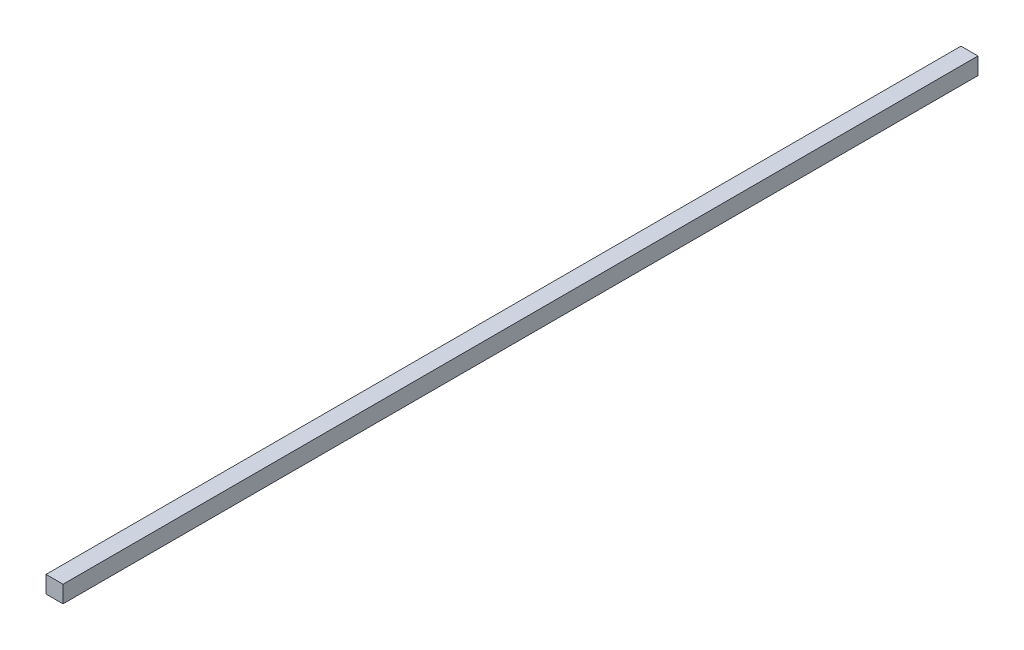
ISO-10303-21;
HEADER;
FILE_DESCRIPTION(('STEP AP214'),'2;1');
FILE_NAME('part.step','',(''),(''),'','','');
FILE_SCHEMA(('AUTOMOTIVE_DESIGN { 1 0 10303 214 1 1 1 1 }'));
ENDSEC;
DATA;
#1=APPLICATION_CONTEXT('core data for automotive mechanical design processes');
#2=APPLICATION_PROTOCOL_DEFINITION('international standard','automotive_design',2000,#1);
#3=PRODUCT_CONTEXT('',#1,'mechanical');
#4=PRODUCT('Part','Part','',(#3));
#5=PRODUCT_RELATED_PRODUCT_CATEGORY('part','',(#4));
#6=PRODUCT_DEFINITION_FORMATION('','',#4);
#7=PRODUCT_DEFINITION_CONTEXT('part definition',#1,'design');
#8=PRODUCT_DEFINITION('design','',#6,#7);
#9=PRODUCT_DEFINITION_SHAPE('','',#8);
#10=(LENGTH_UNIT() NAMED_UNIT(*) SI_UNIT(.MILLI.,.METRE.));
#11=(NAMED_UNIT(*) PLANE_ANGLE_UNIT() SI_UNIT($,.RADIAN.));
#12=(NAMED_UNIT(*) SI_UNIT($,.STERADIAN.) SOLID_ANGLE_UNIT());
#13=UNCERTAINTY_MEASURE_WITH_UNIT(LENGTH_MEASURE(1.E-05),#10,'distance_accuracy_value','');
#14=(GEOMETRIC_REPRESENTATION_CONTEXT(3) GLOBAL_UNCERTAINTY_ASSIGNED_CONTEXT((#13)) GLOBAL_UNIT_ASSIGNED_CONTEXT((#10,
#11,#12)) REPRESENTATION_CONTEXT('',''));
#15=CARTESIAN_POINT('',(0.,0.,0.));
#16=DIRECTION('',(0.,0.,1.));
#17=DIRECTION('',(1.,0.,0.));
#18=AXIS2_PLACEMENT_3D('',#15,#16,#17);
#19=CARTESIAN_POINT('',(-0.883883476483185,-0.883883476483184,95.));
#20=DIRECTION('',(1.,0.,0.));
#21=DIRECTION('',(0.,0.,-1.));
#22=AXIS2_PLACEMENT_3D('',#19,#20,#21);
#23=PLANE('',#22);
#24=DIRECTION('',(0.,-1.,0.));
#25=VECTOR('',#24,1.);
#26=CARTESIAN_POINT('',(-0.883883476483185,-0.883883476483184,0.));
#27=LINE('',#26,#25);
#28=CARTESIAN_POINT('',(-0.883883476483185,0.883883476483185,0.));
#29=VERTEX_POINT('',#28);
#30=CARTESIAN_POINT('',(-0.883883476483185,-0.883883476483184,0.));
#31=VERTEX_POINT('',#30);
#32=EDGE_CURVE('E95',#29,#31,#27,.T.);
#33=ORIENTED_EDGE('',*,*,#32,.T.);
#34=DIRECTION('',(0.,0.,-1.));
#35=VECTOR('',#34,1.);
#36=CARTESIAN_POINT('',(-0.883883476483185,-0.883883476483184,95.));
#37=LINE('',#36,#35);
#38=CARTESIAN_POINT('',(-0.883883476483185,-0.883883476483184,95.));
#39=VERTEX_POINT('',#38);
#40=EDGE_CURVE('E11',#39,#31,#37,.T.);
#41=ORIENTED_EDGE('',*,*,#40,.F.);
#42=DIRECTION('',(0.,-1.,0.));
#43=VECTOR('',#42,1.);
#44=CARTESIAN_POINT('',(-0.883883476483185,-0.883883476483184,95.));
#45=LINE('',#44,#43);
#46=CARTESIAN_POINT('',(-0.883883476483185,0.883883476483185,95.));
#47=VERTEX_POINT('',#46);
#48=EDGE_CURVE('E83',#47,#39,#45,.T.);
#49=ORIENTED_EDGE('',*,*,#48,.F.);
#50=DIRECTION('',(0.,0.,-1.));
#51=VECTOR('',#50,1.);
#52=CARTESIAN_POINT('',(-0.883883476483185,0.883883476483185,95.));
#53=LINE('',#52,#51);
#54=EDGE_CURVE('E91',#47,#29,#53,.T.);
#55=ORIENTED_EDGE('',*,*,#54,.T.);
#56=EDGE_LOOP('',(#33,#41,#49,#55));
#57=FACE_BOUND('',#56,.T.);
#58=ADVANCED_FACE('F32',(#57),#23,.F.);
#59=CARTESIAN_POINT('',(0.883883476483184,-0.883883476483184,95.));
#60=DIRECTION('',(0.,1.,0.));
#61=DIRECTION('',(-1.,0.,0.));
#62=AXIS2_PLACEMENT_3D('',#59,#60,#61);
#63=PLANE('',#62);
#64=DIRECTION('',(1.,0.,0.));
#65=VECTOR('',#64,1.);
#66=CARTESIAN_POINT('',(0.883883476483184,-0.883883476483184,0.));
#67=LINE('',#66,#65);
#68=CARTESIAN_POINT('',(0.883883476483184,-0.883883476483184,0.));
#69=VERTEX_POINT('',#68);
#70=EDGE_CURVE('E87',#31,#69,#67,.T.);
#71=ORIENTED_EDGE('',*,*,#70,.T.);
#72=DIRECTION('',(0.,0.,-1.));
#73=VECTOR('',#72,1.);
#74=CARTESIAN_POINT('',(0.883883476483184,-0.883883476483184,95.));
#75=LINE('',#74,#73);
#76=CARTESIAN_POINT('',(0.883883476483184,-0.883883476483184,95.));
#77=VERTEX_POINT('',#76);
#78=EDGE_CURVE('E40',#77,#69,#75,.T.);
#79=ORIENTED_EDGE('',*,*,#78,.F.);
#80=DIRECTION('',(1.,0.,0.));
#81=VECTOR('',#80,1.);
#82=CARTESIAN_POINT('',(0.883883476483184,-0.883883476483184,95.));
#83=LINE('',#82,#81);
#84=EDGE_CURVE('E78',#39,#77,#83,.T.);
#85=ORIENTED_EDGE('',*,*,#84,.F.);
#86=ORIENTED_EDGE('',*,*,#40,.T.);
#87=EDGE_LOOP('',(#71,#79,#85,#86));
#88=FACE_BOUND('',#87,.T.);
#89=ADVANCED_FACE('F86',(#88),#63,.F.);
#90=CARTESIAN_POINT('',(0.883883476483184,-0.883883476483184,95.));
#91=DIRECTION('',(-1.,0.,0.));
#92=DIRECTION('',(0.,-1.,0.));
#93=AXIS2_PLACEMENT_3D('',#90,#91,#92);
#94=PLANE('',#93);
#95=DIRECTION('',(0.,1.,0.));
#96=VECTOR('',#95,1.);
#97=CARTESIAN_POINT('',(0.883883476483184,-0.883883476483184,0.));
#98=LINE('',#97,#96);
#99=CARTESIAN_POINT('',(0.883883476483184,0.883883476483185,0.));
#100=VERTEX_POINT('',#99);
#101=EDGE_CURVE('E65',#69,#100,#98,.T.);
#102=ORIENTED_EDGE('',*,*,#101,.T.);
#103=DIRECTION('',(0.,0.,-1.));
#104=VECTOR('',#103,1.);
#105=CARTESIAN_POINT('',(0.883883476483184,0.883883476483185,95.));
#106=LINE('',#105,#104);
#107=CARTESIAN_POINT('',(0.883883476483184,0.883883476483185,95.));
#108=VERTEX_POINT('',#107);
#109=EDGE_CURVE('E88',#108,#100,#106,.T.);
#110=ORIENTED_EDGE('',*,*,#109,.F.);
#111=DIRECTION('',(0.,1.,0.));
#112=VECTOR('',#111,1.);
#113=CARTESIAN_POINT('',(0.883883476483184,-0.883883476483184,95.));
#114=LINE('',#113,#112);
#115=EDGE_CURVE('E81',#77,#108,#114,.T.);
#116=ORIENTED_EDGE('',*,*,#115,.F.);
#117=ORIENTED_EDGE('',*,*,#78,.T.);
#118=EDGE_LOOP('',(#102,#110,#116,#117));
#119=FACE_BOUND('',#118,.T.);
#120=ADVANCED_FACE('F89',(#119),#94,.F.);
#121=CARTESIAN_POINT('',(0.883883476483184,0.883883476483185,95.));
#122=DIRECTION('',(0.,-1.,0.));
#123=DIRECTION('',(1.,0.,0.));
#124=AXIS2_PLACEMENT_3D('',#121,#122,#123);
#125=PLANE('',#124);
#126=DIRECTION('',(-1.,0.,0.));
#127=VECTOR('',#126,1.);
#128=CARTESIAN_POINT('',(0.883883476483184,0.883883476483185,0.));
#129=LINE('',#128,#127);
#130=EDGE_CURVE('E71',#100,#29,#129,.T.);
#131=ORIENTED_EDGE('',*,*,#130,.T.);
#132=ORIENTED_EDGE('',*,*,#54,.F.);
#133=DIRECTION('',(-1.,0.,0.));
#134=VECTOR('',#133,1.);
#135=CARTESIAN_POINT('',(0.883883476483184,0.883883476483185,95.));
#136=LINE('',#135,#134);
#137=EDGE_CURVE('E48',#108,#47,#136,.T.);
#138=ORIENTED_EDGE('',*,*,#137,.F.);
#139=ORIENTED_EDGE('',*,*,#109,.T.);
#140=EDGE_LOOP('',(#131,#132,#138,#139));
#141=FACE_BOUND('',#140,.T.);
#142=ADVANCED_FACE('F102',(#141),#125,.F.);
#143=CARTESIAN_POINT('',(0.,0.,95.));
#144=DIRECTION('',(0.,0.,1.));
#145=DIRECTION('',(1.,0.,0.));
#146=AXIS2_PLACEMENT_3D('',#143,#144,#145);
#147=PLANE('',#146);
#148=ORIENTED_EDGE('',*,*,#48,.T.);
#149=ORIENTED_EDGE('',*,*,#84,.T.);
#150=ORIENTED_EDGE('',*,*,#115,.T.);
#151=ORIENTED_EDGE('',*,*,#137,.T.);
#152=EDGE_LOOP('',(#148,#149,#150,#151));
#153=FACE_BOUND('',#152,.T.);
#154=ADVANCED_FACE('F79',(#153),#147,.T.);
#155=CARTESIAN_POINT('',(0.,0.,0.));
#156=DIRECTION('',(0.,0.,1.));
#157=DIRECTION('',(1.,0.,0.));
#158=AXIS2_PLACEMENT_3D('',#155,#156,#157);
#159=PLANE('',#158);
#160=ORIENTED_EDGE('',*,*,#32,.F.);
#161=ORIENTED_EDGE('',*,*,#130,.F.);
#162=ORIENTED_EDGE('',*,*,#101,.F.);
#163=ORIENTED_EDGE('',*,*,#70,.F.);
#164=EDGE_LOOP('',(#160,#161,#162,#163));
#165=FACE_BOUND('',#164,.T.);
#166=ADVANCED_FACE('F105',(#165),#159,.F.);
#167=CLOSED_SHELL('',(#58,#89,#120,#142,#154,#166));
#168=MANIFOLD_SOLID_BREP('B2',#167);
#169=ADVANCED_BREP_SHAPE_REPRESENTATION('',(#18,#168),#14);
#170=SHAPE_DEFINITION_REPRESENTATION(#9,#169);
ENDSEC;
END-ISO-10303-21;
